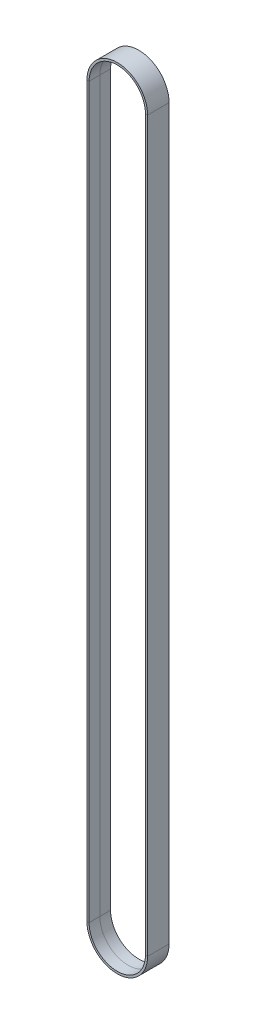
ISO-10303-21;
HEADER;
FILE_DESCRIPTION(('STEP AP214'),'2;1');
FILE_NAME('part.step','',(''),(''),'','','');
FILE_SCHEMA(('AUTOMOTIVE_DESIGN { 1 0 10303 214 1 1 1 1 }'));
ENDSEC;
DATA;
#1=APPLICATION_CONTEXT('core data for automotive mechanical design processes');
#2=APPLICATION_PROTOCOL_DEFINITION('international standard','automotive_design',2000,#1);
#3=PRODUCT_CONTEXT('',#1,'mechanical');
#4=PRODUCT('Part','Part','',(#3));
#5=PRODUCT_RELATED_PRODUCT_CATEGORY('part','',(#4));
#6=PRODUCT_DEFINITION_FORMATION('','',#4);
#7=PRODUCT_DEFINITION_CONTEXT('part definition',#1,'design');
#8=PRODUCT_DEFINITION('design','',#6,#7);
#9=PRODUCT_DEFINITION_SHAPE('','',#8);
#10=(LENGTH_UNIT() NAMED_UNIT(*) SI_UNIT(.MILLI.,.METRE.));
#11=(NAMED_UNIT(*) PLANE_ANGLE_UNIT() SI_UNIT($,.RADIAN.));
#12=(NAMED_UNIT(*) SI_UNIT($,.STERADIAN.) SOLID_ANGLE_UNIT());
#13=UNCERTAINTY_MEASURE_WITH_UNIT(LENGTH_MEASURE(1.E-05),#10,'distance_accuracy_value','');
#14=(GEOMETRIC_REPRESENTATION_CONTEXT(3) GLOBAL_UNCERTAINTY_ASSIGNED_CONTEXT((#13)) GLOBAL_UNIT_ASSIGNED_CONTEXT((#10,
#11,#12)) REPRESENTATION_CONTEXT('',''));
#15=CARTESIAN_POINT('',(0.,0.,0.));
#16=DIRECTION('',(0.,0.,1.));
#17=DIRECTION('',(1.,0.,0.));
#18=AXIS2_PLACEMENT_3D('',#15,#16,#17);
#19=CARTESIAN_POINT('',(-26.2499999999751,0.,10.));
#20=DIRECTION('',(0.,0.,-1.));
#21=DIRECTION('',(-1.,0.,0.));
#22=AXIS2_PLACEMENT_3D('',#19,#20,#21);
#23=PLANE('',#22);
#24=DIRECTION('',(-1.,0.,0.));
#25=VECTOR('',#24,1.);
#26=CARTESIAN_POINT('',(-26.2499999999751,0.,10.));
#27=LINE('',#26,#25);
#28=CARTESIAN_POINT('',(-26.2500000000249,0.,10.));
#29=VERTEX_POINT('',#28);
#30=CARTESIAN_POINT('',(-28.2500000000249,0.,10.));
#31=VERTEX_POINT('',#30);
#32=EDGE_CURVE('E168',#29,#31,#27,.T.);
#33=ORIENTED_EDGE('',*,*,#32,.F.);
#34=CARTESIAN_POINT('',(-2.48689957516035E-11,-2.14273043752655E-11,10.));
#35=DIRECTION('',(0.,0.,-1.));
#36=DIRECTION('',(-1.,8.15967157092761E-13,0.));
#37=AXIS2_PLACEMENT_3D('',#34,#35,#36);
#38=CIRCLE('',#37,26.2499999999503);
#39=CARTESIAN_POINT('',(26.2499999999751,0.,10.));
#40=VERTEX_POINT('',#39);
#41=EDGE_CURVE('E167',#29,#40,#38,.T.);
#42=ORIENTED_EDGE('',*,*,#41,.T.);
#43=DIRECTION('',(1.,0.,0.));
#44=VECTOR('',#43,1.);
#45=CARTESIAN_POINT('',(26.2499999999751,0.,10.));
#46=LINE('',#45,#44);
#47=CARTESIAN_POINT('',(28.2499999999751,0.,10.));
#48=VERTEX_POINT('',#47);
#49=EDGE_CURVE('E147',#40,#48,#46,.T.);
#50=ORIENTED_EDGE('',*,*,#49,.T.);
#51=CARTESIAN_POINT('',(-2.48689957516035E-11,-2.14273043752655E-11,10.));
#52=DIRECTION('',(0.,0.,-1.));
#53=DIRECTION('',(-1.,7.58177545629549E-13,0.));
#54=AXIS2_PLACEMENT_3D('',#51,#52,#53);
#55=CIRCLE('',#54,28.2499999999503);
#56=EDGE_CURVE('E172',#31,#48,#55,.T.);
#57=ORIENTED_EDGE('',*,*,#56,.F.);
#58=EDGE_LOOP('',(#33,#42,#50,#57));
#59=FACE_BOUND('',#58,.T.);
#60=ADVANCED_FACE('F35',(#59),#23,.F.);
#61=CARTESIAN_POINT('',(26.2499999999751,0.,10.));
#62=DIRECTION('',(0.,0.,-1.));
#63=DIRECTION('',(-1.,0.,0.));
#64=AXIS2_PLACEMENT_3D('',#61,#62,#63);
#65=PLANE('',#64);
#66=DIRECTION('',(0.,-1.,0.));
#67=VECTOR('',#66,1.);
#68=CARTESIAN_POINT('',(28.2499999999751,0.,10.));
#69=LINE('',#68,#67);
#70=CARTESIAN_POINT('',(28.2499999999822,-678.67870975463,10.));
#71=VERTEX_POINT('',#70);
#72=EDGE_CURVE('E130',#48,#71,#69,.T.);
#73=ORIENTED_EDGE('',*,*,#72,.F.);
#74=ORIENTED_EDGE('',*,*,#49,.F.);
#75=DIRECTION('',(0.,-1.,0.));
#76=VECTOR('',#75,1.);
#77=CARTESIAN_POINT('',(26.2499999999751,0.,10.));
#78=LINE('',#77,#76);
#79=CARTESIAN_POINT('',(26.2499999999822,-678.67870975463,10.));
#80=VERTEX_POINT('',#79);
#81=EDGE_CURVE('E152',#40,#80,#78,.T.);
#82=ORIENTED_EDGE('',*,*,#81,.T.);
#83=DIRECTION('',(1.,0.,0.));
#84=VECTOR('',#83,1.);
#85=CARTESIAN_POINT('',(26.2499999999822,-678.67870975463,10.));
#86=LINE('',#85,#84);
#87=EDGE_CURVE('E164',#80,#71,#86,.T.);
#88=ORIENTED_EDGE('',*,*,#87,.T.);
#89=EDGE_LOOP('',(#73,#74,#82,#88));
#90=FACE_BOUND('',#89,.T.);
#91=ADVANCED_FACE('F151',(#90),#65,.F.);
#92=CARTESIAN_POINT('',(28.2499999999751,0.,10.));
#93=DIRECTION('',(-1.,0.,0.));
#94=DIRECTION('',(0.,-1.,0.));
#95=AXIS2_PLACEMENT_3D('',#92,#93,#94);
#96=PLANE('',#95);
#97=DIRECTION('',(0.,-1.,0.));
#98=VECTOR('',#97,1.);
#99=CARTESIAN_POINT('',(28.2499999999751,0.,-9.99999999999999));
#100=LINE('',#99,#98);
#101=CARTESIAN_POINT('',(28.2499999999751,0.,-9.99999999999999));
#102=VERTEX_POINT('',#101);
#103=CARTESIAN_POINT('',(28.2499999999822,-678.67870975463,-9.99999999999999));
#104=VERTEX_POINT('',#103);
#105=EDGE_CURVE('E123',#102,#104,#100,.T.);
#106=ORIENTED_EDGE('',*,*,#105,.F.);
#107=DIRECTION('',(0.,0.,-1.));
#108=VECTOR('',#107,1.);
#109=CARTESIAN_POINT('',(28.2499999999751,0.,10.));
#110=LINE('',#109,#108);
#111=EDGE_CURVE('E154',#48,#102,#110,.T.);
#112=ORIENTED_EDGE('',*,*,#111,.F.);
#113=ORIENTED_EDGE('',*,*,#72,.T.);
#114=DIRECTION('',(0.,0.,-1.));
#115=VECTOR('',#114,1.);
#116=CARTESIAN_POINT('',(28.2499999999822,-678.67870975463,10.));
#117=LINE('',#116,#115);
#118=EDGE_CURVE('E230',#71,#104,#117,.T.);
#119=ORIENTED_EDGE('',*,*,#118,.T.);
#120=EDGE_LOOP('',(#106,#112,#113,#119));
#121=FACE_BOUND('',#120,.T.);
#122=ADVANCED_FACE('F252',(#121),#96,.F.);
#123=CARTESIAN_POINT('',(26.2499999999751,0.,-9.99999999999999));
#124=DIRECTION('',(0.,0.,1.));
#125=DIRECTION('',(1.,0.,0.));
#126=AXIS2_PLACEMENT_3D('',#123,#124,#125);
#127=PLANE('',#126);
#128=DIRECTION('',(0.,-1.,0.));
#129=VECTOR('',#128,1.);
#130=CARTESIAN_POINT('',(26.2499999999751,0.,-9.99999999999999));
#131=LINE('',#130,#129);
#132=CARTESIAN_POINT('',(26.2499999999751,0.,-9.99999999999999));
#133=VERTEX_POINT('',#132);
#134=CARTESIAN_POINT('',(26.2499999999822,-678.67870975463,-9.99999999999999));
#135=VERTEX_POINT('',#134);
#136=EDGE_CURVE('E116',#133,#135,#131,.T.);
#137=ORIENTED_EDGE('',*,*,#136,.F.);
#138=DIRECTION('',(-1.,0.,0.));
#139=VECTOR('',#138,1.);
#140=CARTESIAN_POINT('',(26.2499999999751,0.,-9.99999999999999));
#141=LINE('',#140,#139);
#142=EDGE_CURVE('E178',#102,#133,#141,.T.);
#143=ORIENTED_EDGE('',*,*,#142,.F.);
#144=ORIENTED_EDGE('',*,*,#105,.T.);
#145=DIRECTION('',(-1.,0.,0.));
#146=VECTOR('',#145,1.);
#147=CARTESIAN_POINT('',(26.2499999999822,-678.67870975463,-9.99999999999999));
#148=LINE('',#147,#146);
#149=EDGE_CURVE('E214',#104,#135,#148,.T.);
#150=ORIENTED_EDGE('',*,*,#149,.T.);
#151=EDGE_LOOP('',(#137,#143,#144,#150));
#152=FACE_BOUND('',#151,.T.);
#153=ADVANCED_FACE('F254',(#152),#127,.F.);
#154=CARTESIAN_POINT('',(26.2499999999751,0.,0.));
#155=DIRECTION('',(1.,0.,0.));
#156=DIRECTION('',(0.,1.,0.));
#157=AXIS2_PLACEMENT_3D('',#154,#155,#156);
#158=PLANE('',#157);
#159=DIRECTION('',(0.,-1.,0.));
#160=VECTOR('',#159,1.);
#161=CARTESIAN_POINT('',(26.2499999999751,0.,0.));
#162=LINE('',#161,#160);
#163=CARTESIAN_POINT('',(26.2499999999751,0.,0.));
#164=VERTEX_POINT('',#163);
#165=CARTESIAN_POINT('',(26.2499999999822,-678.67870975463,0.));
#166=VERTEX_POINT('',#165);
#167=EDGE_CURVE('E183',#164,#166,#162,.T.);
#168=ORIENTED_EDGE('',*,*,#167,.F.);
#169=DIRECTION('',(0.,0.,1.));
#170=VECTOR('',#169,1.);
#171=CARTESIAN_POINT('',(26.2499999999751,0.,0.));
#172=LINE('',#171,#170);
#173=EDGE_CURVE('E175',#133,#164,#172,.T.);
#174=ORIENTED_EDGE('',*,*,#173,.F.);
#175=ORIENTED_EDGE('',*,*,#136,.T.);
#176=DIRECTION('',(0.,0.,1.));
#177=VECTOR('',#176,1.);
#178=CARTESIAN_POINT('',(26.2499999999822,-678.67870975463,0.));
#179=LINE('',#178,#177);
#180=EDGE_CURVE('E201',#135,#166,#179,.T.);
#181=ORIENTED_EDGE('',*,*,#180,.T.);
#182=EDGE_LOOP('',(#168,#174,#175,#181));
#183=FACE_BOUND('',#182,.T.);
#184=ADVANCED_FACE('F200',(#183),#158,.F.);
#185=CARTESIAN_POINT('',(26.2499999999751,0.,0.));
#186=DIRECTION('',(1.,0.,0.));
#187=DIRECTION('',(0.,1.,0.));
#188=AXIS2_PLACEMENT_3D('',#185,#186,#187);
#189=PLANE('',#188);
#190=DIRECTION('',(0.,0.,1.));
#191=VECTOR('',#190,1.);
#192=CARTESIAN_POINT('',(26.2499999999822,-678.67870975463,0.));
#193=LINE('',#192,#191);
#194=EDGE_CURVE('E162',#166,#80,#193,.T.);
#195=ORIENTED_EDGE('',*,*,#194,.T.);
#196=ORIENTED_EDGE('',*,*,#81,.F.);
#197=DIRECTION('',(0.,0.,1.));
#198=VECTOR('',#197,1.);
#199=CARTESIAN_POINT('',(26.2499999999751,0.,0.));
#200=LINE('',#199,#198);
#201=EDGE_CURVE('E161',#164,#40,#200,.T.);
#202=ORIENTED_EDGE('',*,*,#201,.F.);
#203=ORIENTED_EDGE('',*,*,#167,.T.);
#204=EDGE_LOOP('',(#195,#196,#202,#203));
#205=FACE_BOUND('',#204,.T.);
#206=ADVANCED_FACE('F159',(#205),#189,.F.);
#207=CARTESIAN_POINT('',(26.2499999999822,-678.67870975463,10.));
#208=DIRECTION('',(0.,0.,-1.));
#209=DIRECTION('',(-1.,0.,0.));
#210=AXIS2_PLACEMENT_3D('',#207,#208,#209);
#211=PLANE('',#210);
#212=CARTESIAN_POINT('',(-1.77635683940025E-11,-678.678709754652,10.));
#213=DIRECTION('',(0.,0.,-1.));
#214=DIRECTION('',(1.,7.58488650451877E-13,0.));
#215=AXIS2_PLACEMENT_3D('',#212,#213,#214);
#216=CIRCLE('',#215,28.25);
#217=CARTESIAN_POINT('',(-28.2500000000178,-678.678709754673,10.));
#218=VERTEX_POINT('',#217);
#219=EDGE_CURVE('E228',#71,#218,#216,.T.);
#220=ORIENTED_EDGE('',*,*,#219,.F.);
#221=ORIENTED_EDGE('',*,*,#87,.F.);
#222=CARTESIAN_POINT('',(-1.77635683940025E-11,-678.678709754652,10.));
#223=DIRECTION('',(0.,0.,-1.));
#224=DIRECTION('',(1.,8.16278261914877E-13,0.));
#225=AXIS2_PLACEMENT_3D('',#222,#223,#224);
#226=CIRCLE('',#225,26.25);
#227=CARTESIAN_POINT('',(-26.2500000000178,-678.678709754673,10.));
#228=VERTEX_POINT('',#227);
#229=EDGE_CURVE('E182',#80,#228,#226,.T.);
#230=ORIENTED_EDGE('',*,*,#229,.T.);
#231=DIRECTION('',(-1.,0.,0.));
#232=VECTOR('',#231,1.);
#233=CARTESIAN_POINT('',(-26.2500000000178,-678.678709754673,10.));
#234=LINE('',#233,#232);
#235=EDGE_CURVE('E239',#228,#218,#234,.T.);
#236=ORIENTED_EDGE('',*,*,#235,.T.);
#237=EDGE_LOOP('',(#220,#221,#230,#236));
#238=FACE_BOUND('',#237,.T.);
#239=ADVANCED_FACE('F247',(#238),#211,.F.);
#240=CARTESIAN_POINT('',(-1.77635683940025E-11,-678.678709754652,0.));
#241=DIRECTION('',(0.,0.,-1.));
#242=DIRECTION('',(-1.,0.,0.));
#243=AXIS2_PLACEMENT_3D('',#240,#241,#242);
#244=CYLINDRICAL_SURFACE('',#243,28.25);
#245=CARTESIAN_POINT('',(-1.77635683940025E-11,-678.678709754652,-9.99999999999999));
#246=DIRECTION('',(0.,0.,-1.));
#247=DIRECTION('',(1.,7.58488650451877E-13,0.));
#248=AXIS2_PLACEMENT_3D('',#245,#246,#247);
#249=CIRCLE('',#248,28.25);
#250=CARTESIAN_POINT('',(-28.2500000000178,-678.678709754673,-9.99999999999999));
#251=VERTEX_POINT('',#250);
#252=EDGE_CURVE('E102',#104,#251,#249,.T.);
#253=ORIENTED_EDGE('',*,*,#252,.F.);
#254=ORIENTED_EDGE('',*,*,#118,.F.);
#255=ORIENTED_EDGE('',*,*,#219,.T.);
#256=DIRECTION('',(0.,0.,-1.));
#257=VECTOR('',#256,1.);
#258=CARTESIAN_POINT('',(-28.2500000000178,-678.678709754673,10.));
#259=LINE('',#258,#257);
#260=EDGE_CURVE('E226',#218,#251,#259,.T.);
#261=ORIENTED_EDGE('',*,*,#260,.T.);
#262=EDGE_LOOP('',(#253,#254,#255,#261));
#263=FACE_BOUND('',#262,.T.);
#264=ADVANCED_FACE('F251',(#263),#244,.T.);
#265=CARTESIAN_POINT('',(26.2499999999822,-678.67870975463,-9.99999999999999));
#266=DIRECTION('',(0.,0.,1.));
#267=DIRECTION('',(1.,0.,0.));
#268=AXIS2_PLACEMENT_3D('',#265,#266,#267);
#269=PLANE('',#268);
#270=CARTESIAN_POINT('',(-1.77635683940025E-11,-678.678709754652,-9.99999999999999));
#271=DIRECTION('',(0.,0.,-1.));
#272=DIRECTION('',(1.,8.16278261914877E-13,0.));
#273=AXIS2_PLACEMENT_3D('',#270,#271,#272);
#274=CIRCLE('',#273,26.25);
#275=CARTESIAN_POINT('',(-26.2500000000178,-678.678709754673,-9.99999999999999));
#276=VERTEX_POINT('',#275);
#277=EDGE_CURVE('E94',#135,#276,#274,.T.);
#278=ORIENTED_EDGE('',*,*,#277,.F.);
#279=ORIENTED_EDGE('',*,*,#149,.F.);
#280=ORIENTED_EDGE('',*,*,#252,.T.);
#281=DIRECTION('',(1.,0.,0.));
#282=VECTOR('',#281,1.);
#283=CARTESIAN_POINT('',(-26.2500000000178,-678.678709754673,-9.99999999999999));
#284=LINE('',#283,#282);
#285=EDGE_CURVE('E211',#251,#276,#284,.T.);
#286=ORIENTED_EDGE('',*,*,#285,.T.);
#287=EDGE_LOOP('',(#278,#279,#280,#286));
#288=FACE_BOUND('',#287,.T.);
#289=ADVANCED_FACE('F279',(#288),#269,.F.);
#290=CARTESIAN_POINT('',(-1.77635683940025E-11,-678.678709754652,0.));
#291=DIRECTION('',(0.,0.,-1.));
#292=DIRECTION('',(-1.,0.,0.));
#293=AXIS2_PLACEMENT_3D('',#290,#291,#292);
#294=CYLINDRICAL_SURFACE('',#293,26.25);
#295=CARTESIAN_POINT('',(-1.77635683940025E-11,-678.678709754652,0.));
#296=DIRECTION('',(0.,0.,-1.));
#297=DIRECTION('',(1.,8.16278261914877E-13,0.));
#298=AXIS2_PLACEMENT_3D('',#295,#296,#297);
#299=CIRCLE('',#298,26.25);
#300=CARTESIAN_POINT('',(-26.2500000000178,-678.678709754673,0.));
#301=VERTEX_POINT('',#300);
#302=EDGE_CURVE('E85',#166,#301,#299,.T.);
#303=ORIENTED_EDGE('',*,*,#302,.F.);
#304=ORIENTED_EDGE('',*,*,#180,.F.);
#305=ORIENTED_EDGE('',*,*,#277,.T.);
#306=DIRECTION('',(0.,0.,1.));
#307=VECTOR('',#306,1.);
#308=CARTESIAN_POINT('',(-26.2500000000178,-678.678709754673,0.));
#309=LINE('',#308,#307);
#310=EDGE_CURVE('E188',#276,#301,#309,.T.);
#311=ORIENTED_EDGE('',*,*,#310,.T.);
#312=EDGE_LOOP('',(#303,#304,#305,#311));
#313=FACE_BOUND('',#312,.T.);
#314=ADVANCED_FACE('F289',(#313),#294,.F.);
#315=CARTESIAN_POINT('',(-1.77635683940025E-11,-678.678709754652,0.));
#316=DIRECTION('',(0.,0.,-1.));
#317=DIRECTION('',(-1.,0.,0.));
#318=AXIS2_PLACEMENT_3D('',#315,#316,#317);
#319=CYLINDRICAL_SURFACE('',#318,26.25);
#320=DIRECTION('',(0.,0.,1.));
#321=VECTOR('',#320,1.);
#322=CARTESIAN_POINT('',(-26.2500000000178,-678.678709754673,0.));
#323=LINE('',#322,#321);
#324=EDGE_CURVE('E184',#301,#228,#323,.T.);
#325=ORIENTED_EDGE('',*,*,#324,.T.);
#326=ORIENTED_EDGE('',*,*,#229,.F.);
#327=ORIENTED_EDGE('',*,*,#194,.F.);
#328=ORIENTED_EDGE('',*,*,#302,.T.);
#329=EDGE_LOOP('',(#325,#326,#327,#328));
#330=FACE_BOUND('',#329,.T.);
#331=ADVANCED_FACE('F272',(#330),#319,.F.);
#332=CARTESIAN_POINT('',(-26.2500000000178,-678.678709754673,10.));
#333=DIRECTION('',(0.,0.,-1.));
#334=DIRECTION('',(-1.,0.,0.));
#335=AXIS2_PLACEMENT_3D('',#332,#333,#334);
#336=PLANE('',#335);
#337=DIRECTION('',(0.,1.,0.));
#338=VECTOR('',#337,1.);
#339=CARTESIAN_POINT('',(-28.2500000000178,-678.678709754673,10.));
#340=LINE('',#339,#338);
#341=EDGE_CURVE('E224',#218,#31,#340,.T.);
#342=ORIENTED_EDGE('',*,*,#341,.F.);
#343=ORIENTED_EDGE('',*,*,#235,.F.);
#344=DIRECTION('',(0.,1.,0.));
#345=VECTOR('',#344,1.);
#346=CARTESIAN_POINT('',(-26.2500000000178,-678.678709754673,10.));
#347=LINE('',#346,#345);
#348=EDGE_CURVE('E185',#228,#29,#347,.T.);
#349=ORIENTED_EDGE('',*,*,#348,.T.);
#350=ORIENTED_EDGE('',*,*,#32,.T.);
#351=EDGE_LOOP('',(#342,#343,#349,#350));
#352=FACE_BOUND('',#351,.T.);
#353=ADVANCED_FACE('F268',(#352),#336,.F.);
#354=CARTESIAN_POINT('',(-28.2500000000178,-678.678709754673,10.));
#355=DIRECTION('',(1.,0.,0.));
#356=DIRECTION('',(0.,1.,0.));
#357=AXIS2_PLACEMENT_3D('',#354,#355,#356);
#358=PLANE('',#357);
#359=DIRECTION('',(0.,1.,0.));
#360=VECTOR('',#359,1.);
#361=CARTESIAN_POINT('',(-28.2500000000178,-678.678709754673,-9.99999999999999));
#362=LINE('',#361,#360);
#363=CARTESIAN_POINT('',(-28.2500000000249,0.,-9.99999999999999));
#364=VERTEX_POINT('',#363);
#365=EDGE_CURVE('E209',#251,#364,#362,.T.);
#366=ORIENTED_EDGE('',*,*,#365,.F.);
#367=ORIENTED_EDGE('',*,*,#260,.F.);
#368=ORIENTED_EDGE('',*,*,#341,.T.);
#369=DIRECTION('',(0.,0.,-1.));
#370=VECTOR('',#369,1.);
#371=CARTESIAN_POINT('',(-28.2499999999751,0.,10.));
#372=LINE('',#371,#370);
#373=EDGE_CURVE('E221',#31,#364,#372,.T.);
#374=ORIENTED_EDGE('',*,*,#373,.T.);
#375=EDGE_LOOP('',(#366,#367,#368,#374));
#376=FACE_BOUND('',#375,.T.);
#377=ADVANCED_FACE('F271',(#376),#358,.F.);
#378=CARTESIAN_POINT('',(-26.2500000000178,-678.678709754673,-9.99999999999999));
#379=DIRECTION('',(0.,0.,1.));
#380=DIRECTION('',(1.,0.,0.));
#381=AXIS2_PLACEMENT_3D('',#378,#379,#380);
#382=PLANE('',#381);
#383=DIRECTION('',(0.,1.,0.));
#384=VECTOR('',#383,1.);
#385=CARTESIAN_POINT('',(-26.2500000000178,-678.678709754673,-9.99999999999999));
#386=LINE('',#385,#384);
#387=CARTESIAN_POINT('',(-26.2500000000249,0.,-9.99999999999999));
#388=VERTEX_POINT('',#387);
#389=EDGE_CURVE('E60',#276,#388,#386,.T.);
#390=ORIENTED_EDGE('',*,*,#389,.F.);
#391=ORIENTED_EDGE('',*,*,#285,.F.);
#392=ORIENTED_EDGE('',*,*,#365,.T.);
#393=DIRECTION('',(1.,0.,0.));
#394=VECTOR('',#393,1.);
#395=CARTESIAN_POINT('',(-26.2499999999751,0.,-9.99999999999999));
#396=LINE('',#395,#394);
#397=EDGE_CURVE('E207',#364,#388,#396,.T.);
#398=ORIENTED_EDGE('',*,*,#397,.T.);
#399=EDGE_LOOP('',(#390,#391,#392,#398));
#400=FACE_BOUND('',#399,.T.);
#401=ADVANCED_FACE('F300',(#400),#382,.F.);
#402=CARTESIAN_POINT('',(-26.2500000000178,-678.678709754673,0.));
#403=DIRECTION('',(-1.,0.,0.));
#404=DIRECTION('',(0.,-1.,0.));
#405=AXIS2_PLACEMENT_3D('',#402,#403,#404);
#406=PLANE('',#405);
#407=DIRECTION('',(0.,1.,0.));
#408=VECTOR('',#407,1.);
#409=CARTESIAN_POINT('',(-26.2500000000178,-678.678709754673,0.));
#410=LINE('',#409,#408);
#411=CARTESIAN_POINT('',(-26.2500000000249,0.,0.));
#412=VERTEX_POINT('',#411);
#413=EDGE_CURVE('E52',#301,#412,#410,.T.);
#414=ORIENTED_EDGE('',*,*,#413,.F.);
#415=ORIENTED_EDGE('',*,*,#310,.F.);
#416=ORIENTED_EDGE('',*,*,#389,.T.);
#417=DIRECTION('',(0.,0.,1.));
#418=VECTOR('',#417,1.);
#419=CARTESIAN_POINT('',(-26.2499999999751,0.,0.));
#420=LINE('',#419,#418);
#421=EDGE_CURVE('E193',#388,#412,#420,.T.);
#422=ORIENTED_EDGE('',*,*,#421,.T.);
#423=EDGE_LOOP('',(#414,#415,#416,#422));
#424=FACE_BOUND('',#423,.T.);
#425=ADVANCED_FACE('F292',(#424),#406,.F.);
#426=CARTESIAN_POINT('',(-26.2500000000178,-678.678709754673,0.));
#427=DIRECTION('',(-1.,0.,0.));
#428=DIRECTION('',(0.,-1.,0.));
#429=AXIS2_PLACEMENT_3D('',#426,#427,#428);
#430=PLANE('',#429);
#431=DIRECTION('',(0.,0.,1.));
#432=VECTOR('',#431,1.);
#433=CARTESIAN_POINT('',(-26.2499999999751,0.,0.));
#434=LINE('',#433,#432);
#435=EDGE_CURVE('E39',#412,#29,#434,.T.);
#436=ORIENTED_EDGE('',*,*,#435,.T.);
#437=ORIENTED_EDGE('',*,*,#348,.F.);
#438=ORIENTED_EDGE('',*,*,#324,.F.);
#439=ORIENTED_EDGE('',*,*,#413,.T.);
#440=EDGE_LOOP('',(#436,#437,#438,#439));
#441=FACE_BOUND('',#440,.T.);
#442=ADVANCED_FACE('F194',(#441),#430,.F.);
#443=CARTESIAN_POINT('',(-2.48689957516035E-11,-2.14273043752655E-11,0.));
#444=DIRECTION('',(0.,0.,-1.));
#445=DIRECTION('',(-1.,0.,0.));
#446=AXIS2_PLACEMENT_3D('',#443,#444,#445);
#447=CYLINDRICAL_SURFACE('',#446,28.2499999999503);
#448=ORIENTED_EDGE('',*,*,#56,.T.);
#449=ORIENTED_EDGE('',*,*,#111,.T.);
#450=CARTESIAN_POINT('',(-2.48689957516035E-11,-2.14273043752655E-11,-9.99999999999999));
#451=DIRECTION('',(0.,0.,-1.));
#452=DIRECTION('',(-1.,7.58177545629549E-13,0.));
#453=AXIS2_PLACEMENT_3D('',#450,#451,#452);
#454=CIRCLE('',#453,28.2499999999503);
#455=EDGE_CURVE('E205',#364,#102,#454,.T.);
#456=ORIENTED_EDGE('',*,*,#455,.F.);
#457=ORIENTED_EDGE('',*,*,#373,.F.);
#458=EDGE_LOOP('',(#448,#449,#456,#457));
#459=FACE_BOUND('',#458,.T.);
#460=ADVANCED_FACE('F291',(#459),#447,.T.);
#461=CARTESIAN_POINT('',(-26.2499999999751,0.,-9.99999999999999));
#462=DIRECTION('',(0.,0.,1.));
#463=DIRECTION('',(1.,0.,0.));
#464=AXIS2_PLACEMENT_3D('',#461,#462,#463);
#465=PLANE('',#464);
#466=ORIENTED_EDGE('',*,*,#455,.T.);
#467=ORIENTED_EDGE('',*,*,#142,.T.);
#468=CARTESIAN_POINT('',(-2.48689957516035E-11,-2.14273043752655E-11,-9.99999999999999));
#469=DIRECTION('',(0.,0.,-1.));
#470=DIRECTION('',(-1.,8.15967157092761E-13,0.));
#471=AXIS2_PLACEMENT_3D('',#468,#469,#470);
#472=CIRCLE('',#471,26.2499999999503);
#473=EDGE_CURVE('E44',#388,#133,#472,.T.);
#474=ORIENTED_EDGE('',*,*,#473,.F.);
#475=ORIENTED_EDGE('',*,*,#397,.F.);
#476=EDGE_LOOP('',(#466,#467,#474,#475));
#477=FACE_BOUND('',#476,.T.);
#478=ADVANCED_FACE('F297',(#477),#465,.F.);
#479=CARTESIAN_POINT('',(-2.48689957516035E-11,-2.14273043752655E-11,0.));
#480=DIRECTION('',(0.,0.,-1.));
#481=DIRECTION('',(-1.,0.,0.));
#482=AXIS2_PLACEMENT_3D('',#479,#480,#481);
#483=CYLINDRICAL_SURFACE('',#482,26.2499999999503);
#484=ORIENTED_EDGE('',*,*,#473,.T.);
#485=ORIENTED_EDGE('',*,*,#173,.T.);
#486=CARTESIAN_POINT('',(-2.48689957516035E-11,-2.14273043752655E-11,0.));
#487=DIRECTION('',(0.,0.,-1.));
#488=DIRECTION('',(-1.,8.15967157092761E-13,0.));
#489=AXIS2_PLACEMENT_3D('',#486,#487,#488);
#490=CIRCLE('',#489,26.2499999999503);
#491=EDGE_CURVE('E11',#412,#164,#490,.T.);
#492=ORIENTED_EDGE('',*,*,#491,.F.);
#493=ORIENTED_EDGE('',*,*,#421,.F.);
#494=EDGE_LOOP('',(#484,#485,#492,#493));
#495=FACE_BOUND('',#494,.T.);
#496=ADVANCED_FACE('F198',(#495),#483,.F.);
#497=CARTESIAN_POINT('',(-2.48689957516035E-11,-2.14273043752655E-11,0.));
#498=DIRECTION('',(0.,0.,-1.));
#499=DIRECTION('',(-1.,0.,0.));
#500=AXIS2_PLACEMENT_3D('',#497,#498,#499);
#501=CYLINDRICAL_SURFACE('',#500,26.2499999999503);
#502=ORIENTED_EDGE('',*,*,#491,.T.);
#503=ORIENTED_EDGE('',*,*,#201,.T.);
#504=ORIENTED_EDGE('',*,*,#41,.F.);
#505=ORIENTED_EDGE('',*,*,#435,.F.);
#506=EDGE_LOOP('',(#502,#503,#504,#505));
#507=FACE_BOUND('',#506,.T.);
#508=ADVANCED_FACE('F37',(#507),#501,.F.);
#509=CLOSED_SHELL('',(#60,#91,#122,#153,#184,#206,#239,#264,#289,#314,#331,#353,#377,#401,#425,
#442,#460,#478,#496,#508));
#510=MANIFOLD_SOLID_BREP('B2',#509);
#511=ADVANCED_BREP_SHAPE_REPRESENTATION('',(#18,#510),#14);
#512=SHAPE_DEFINITION_REPRESENTATION(#9,#511);
ENDSEC;
END-ISO-10303-21;
